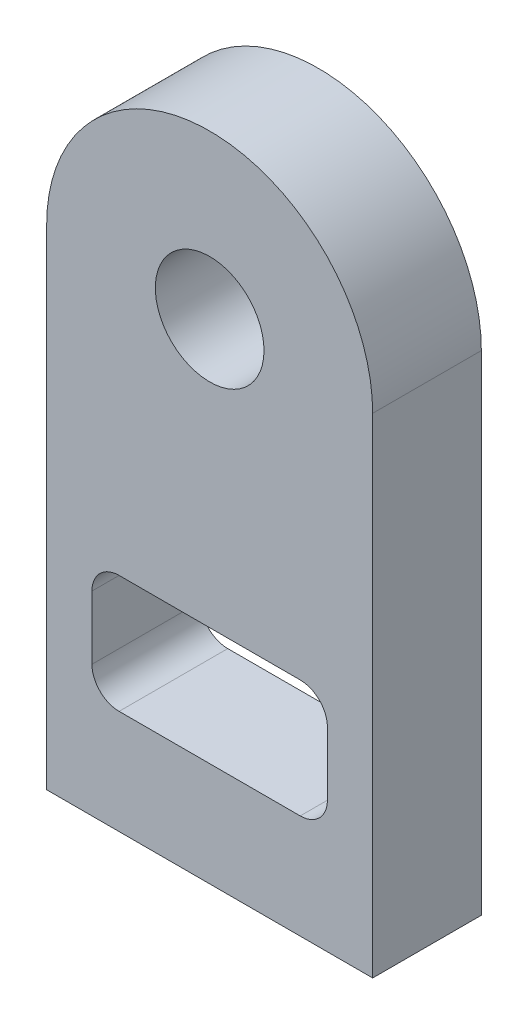
ISO-10303-21;
HEADER;
FILE_DESCRIPTION(('STEP AP214'),'2;1');
FILE_NAME('part.step','',(''),(''),'','','');
FILE_SCHEMA(('AUTOMOTIVE_DESIGN { 1 0 10303 214 1 1 1 1 }'));
ENDSEC;
DATA;
#1=APPLICATION_CONTEXT('core data for automotive mechanical design processes');
#2=APPLICATION_PROTOCOL_DEFINITION('international standard','automotive_design',2000,#1);
#3=PRODUCT_CONTEXT('',#1,'mechanical');
#4=PRODUCT('Part','Part','',(#3));
#5=PRODUCT_RELATED_PRODUCT_CATEGORY('part','',(#4));
#6=PRODUCT_DEFINITION_FORMATION('','',#4);
#7=PRODUCT_DEFINITION_CONTEXT('part definition',#1,'design');
#8=PRODUCT_DEFINITION('design','',#6,#7);
#9=PRODUCT_DEFINITION_SHAPE('','',#8);
#10=(LENGTH_UNIT() NAMED_UNIT(*) SI_UNIT(.MILLI.,.METRE.));
#11=(NAMED_UNIT(*) PLANE_ANGLE_UNIT() SI_UNIT($,.RADIAN.));
#12=(NAMED_UNIT(*) SI_UNIT($,.STERADIAN.) SOLID_ANGLE_UNIT());
#13=UNCERTAINTY_MEASURE_WITH_UNIT(LENGTH_MEASURE(1.E-05),#10,'distance_accuracy_value','');
#14=(GEOMETRIC_REPRESENTATION_CONTEXT(3) GLOBAL_UNCERTAINTY_ASSIGNED_CONTEXT((#13)) GLOBAL_UNIT_ASSIGNED_CONTEXT((#10,
#11,#12)) REPRESENTATION_CONTEXT('',''));
#15=CARTESIAN_POINT('',(0.,0.,0.));
#16=DIRECTION('',(0.,0.,1.));
#17=DIRECTION('',(1.,0.,0.));
#18=AXIS2_PLACEMENT_3D('',#15,#16,#17);
#19=CARTESIAN_POINT('',(155.0913565475,212.4940368431,3.));
#20=DIRECTION('',(0.,0.,1.));
#21=DIRECTION('',(1.,0.,0.));
#22=AXIS2_PLACEMENT_3D('',#19,#20,#21);
#23=PLANE('',#22);
#24=CARTESIAN_POINT('',(155.0913565475,212.4940368431,3.));
#25=DIRECTION('',(0.,0.,1.));
#26=DIRECTION('',(1.,0.,0.));
#27=AXIS2_PLACEMENT_3D('',#24,#25,#26);
#28=CIRCLE('',#27,1.5);
#29=CARTESIAN_POINT('',(156.5913565475,212.4940368431,3.));
#30=VERTEX_POINT('',#29);
#31=EDGE_CURVE('E187',#30,#30,#28,.T.);
#32=ORIENTED_EDGE('',*,*,#31,.F.);
#33=EDGE_LOOP('',(#32));
#34=FACE_BOUND('',#33,.T.);
#35=CARTESIAN_POINT('',(155.0913565475,212.4940368431,3.));
#36=DIRECTION('',(0.,0.,1.));
#37=DIRECTION('',(1.,0.,0.));
#38=AXIS2_PLACEMENT_3D('',#35,#36,#37);
#39=CIRCLE('',#38,4.5);
#40=CARTESIAN_POINT('',(159.5913565475,212.4940368431,3.));
#41=VERTEX_POINT('',#40);
#42=CARTESIAN_POINT('',(150.5913565475,212.4940368431,3.));
#43=VERTEX_POINT('',#42);
#44=EDGE_CURVE('E193',#41,#43,#39,.T.);
#45=ORIENTED_EDGE('',*,*,#44,.T.);
#46=DIRECTION('',(0.,-1.,0.));
#47=VECTOR('',#46,1.);
#48=CARTESIAN_POINT('',(150.5913565475,198.9940368431,3.));
#49=LINE('',#48,#47);
#50=CARTESIAN_POINT('',(150.5913565475,198.9940368431,3.));
#51=VERTEX_POINT('',#50);
#52=EDGE_CURVE('E196',#43,#51,#49,.T.);
#53=ORIENTED_EDGE('',*,*,#52,.T.);
#54=DIRECTION('',(1.,0.,0.));
#55=VECTOR('',#54,1.);
#56=CARTESIAN_POINT('',(159.5913565475,198.9940368431,3.));
#57=LINE('',#56,#55);
#58=CARTESIAN_POINT('',(159.5913565475,198.9940368431,3.));
#59=VERTEX_POINT('',#58);
#60=EDGE_CURVE('E199',#51,#59,#57,.T.);
#61=ORIENTED_EDGE('',*,*,#60,.T.);
#62=DIRECTION('',(0.,1.,0.));
#63=VECTOR('',#62,1.);
#64=CARTESIAN_POINT('',(159.5913565475,212.4940368431,3.));
#65=LINE('',#64,#63);
#66=EDGE_CURVE('E201',#59,#41,#65,.T.);
#67=ORIENTED_EDGE('',*,*,#66,.T.);
#68=EDGE_LOOP('',(#45,#53,#61,#67));
#69=FACE_BOUND('',#68,.T.);
#70=DIRECTION('',(1.,0.,0.));
#71=VECTOR('',#70,1.);
#72=CARTESIAN_POINT('',(157.5913565475,201.8690368431,3.));
#73=LINE('',#72,#71);
#74=CARTESIAN_POINT('',(152.5913565475,201.8690368431,3.));
#75=VERTEX_POINT('',#74);
#76=CARTESIAN_POINT('',(157.5913565475,201.8690368431,3.));
#77=VERTEX_POINT('',#76);
#78=EDGE_CURVE('E130',#75,#77,#73,.T.);
#79=ORIENTED_EDGE('',*,*,#78,.F.);
#80=CARTESIAN_POINT('',(152.5913565475,202.6190368431,3.));
#81=DIRECTION('',(0.,0.,1.));
#82=DIRECTION('',(1.,0.,0.));
#83=AXIS2_PLACEMENT_3D('',#80,#81,#82);
#84=CIRCLE('',#83,0.750000000000001);
#85=CARTESIAN_POINT('',(151.8413565475,202.6190368431,3.));
#86=VERTEX_POINT('',#85);
#87=EDGE_CURVE('E122',#86,#75,#84,.T.);
#88=ORIENTED_EDGE('',*,*,#87,.F.);
#89=DIRECTION('',(0.,-1.,0.));
#90=VECTOR('',#89,1.);
#91=CARTESIAN_POINT('',(151.8413565475,202.6190368431,3.));
#92=LINE('',#91,#90);
#93=CARTESIAN_POINT('',(151.8413565475,204.3690368431,3.));
#94=VERTEX_POINT('',#93);
#95=EDGE_CURVE('E155',#94,#86,#92,.T.);
#96=ORIENTED_EDGE('',*,*,#95,.F.);
#97=CARTESIAN_POINT('',(152.5913565475,204.3690368431,3.));
#98=DIRECTION('',(0.,0.,1.));
#99=DIRECTION('',(1.,0.,0.));
#100=AXIS2_PLACEMENT_3D('',#97,#98,#99);
#101=CIRCLE('',#100,0.750000000000001);
#102=CARTESIAN_POINT('',(152.5913565475,205.1190368431,3.));
#103=VERTEX_POINT('',#102);
#104=EDGE_CURVE('E153',#103,#94,#101,.T.);
#105=ORIENTED_EDGE('',*,*,#104,.F.);
#106=DIRECTION('',(-1.,0.,0.));
#107=VECTOR('',#106,1.);
#108=CARTESIAN_POINT('',(152.5913565475,205.1190368431,3.));
#109=LINE('',#108,#107);
#110=CARTESIAN_POINT('',(157.5913565475,205.1190368431,3.));
#111=VERTEX_POINT('',#110);
#112=EDGE_CURVE('E151',#111,#103,#109,.T.);
#113=ORIENTED_EDGE('',*,*,#112,.F.);
#114=CARTESIAN_POINT('',(157.5913565475,204.3690368431,3.));
#115=DIRECTION('',(0.,0.,1.));
#116=DIRECTION('',(1.,0.,0.));
#117=AXIS2_PLACEMENT_3D('',#114,#115,#116);
#118=CIRCLE('',#117,0.750000000000001);
#119=CARTESIAN_POINT('',(158.3413565475,204.3690368431,3.));
#120=VERTEX_POINT('',#119);
#121=EDGE_CURVE('E149',#120,#111,#118,.T.);
#122=ORIENTED_EDGE('',*,*,#121,.F.);
#123=DIRECTION('',(0.,1.,0.));
#124=VECTOR('',#123,1.);
#125=CARTESIAN_POINT('',(158.3413565475,204.3690368431,3.));
#126=LINE('',#125,#124);
#127=CARTESIAN_POINT('',(158.3413565475,202.6190368431,3.));
#128=VERTEX_POINT('',#127);
#129=EDGE_CURVE('E145',#128,#120,#126,.T.);
#130=ORIENTED_EDGE('',*,*,#129,.F.);
#131=CARTESIAN_POINT('',(157.5913565475,202.6190368431,3.));
#132=DIRECTION('',(0.,0.,1.));
#133=DIRECTION('',(1.,0.,0.));
#134=AXIS2_PLACEMENT_3D('',#131,#132,#133);
#135=CIRCLE('',#134,0.750000000000001);
#136=EDGE_CURVE('E143',#77,#128,#135,.T.);
#137=ORIENTED_EDGE('',*,*,#136,.F.);
#138=EDGE_LOOP('',(#79,#88,#96,#105,#113,#122,#130,#137));
#139=FACE_BOUND('',#138,.T.);
#140=ADVANCED_FACE('F33',(#34,#69,#139),#23,.T.);
#141=CARTESIAN_POINT('',(155.0913565475,212.4940368431,0.));
#142=DIRECTION('',(0.,0.,1.));
#143=DIRECTION('',(1.,0.,0.));
#144=AXIS2_PLACEMENT_3D('',#141,#142,#143);
#145=PLANE('',#144);
#146=CARTESIAN_POINT('',(155.0913565475,212.4940368431,0.));
#147=DIRECTION('',(0.,0.,1.));
#148=DIRECTION('',(1.,0.,0.));
#149=AXIS2_PLACEMENT_3D('',#146,#147,#148);
#150=CIRCLE('',#149,1.5);
#151=CARTESIAN_POINT('',(156.5913565475,212.4940368431,0.));
#152=VERTEX_POINT('',#151);
#153=EDGE_CURVE('E138',#152,#152,#150,.T.);
#154=ORIENTED_EDGE('',*,*,#153,.T.);
#155=EDGE_LOOP('',(#154));
#156=FACE_BOUND('',#155,.T.);
#157=CARTESIAN_POINT('',(155.0913565475,212.4940368431,0.));
#158=DIRECTION('',(0.,0.,1.));
#159=DIRECTION('',(1.,0.,0.));
#160=AXIS2_PLACEMENT_3D('',#157,#158,#159);
#161=CIRCLE('',#160,4.5);
#162=CARTESIAN_POINT('',(159.5913565475,212.4940368431,0.));
#163=VERTEX_POINT('',#162);
#164=CARTESIAN_POINT('',(150.5913565475,212.4940368431,0.));
#165=VERTEX_POINT('',#164);
#166=EDGE_CURVE('E190',#163,#165,#161,.T.);
#167=ORIENTED_EDGE('',*,*,#166,.F.);
#168=DIRECTION('',(0.,1.,0.));
#169=VECTOR('',#168,1.);
#170=CARTESIAN_POINT('',(159.5913565475,212.4940368431,0.));
#171=LINE('',#170,#169);
#172=CARTESIAN_POINT('',(159.5913565475,198.9940368431,0.));
#173=VERTEX_POINT('',#172);
#174=EDGE_CURVE('E197',#173,#163,#171,.T.);
#175=ORIENTED_EDGE('',*,*,#174,.F.);
#176=DIRECTION('',(1.,0.,0.));
#177=VECTOR('',#176,1.);
#178=CARTESIAN_POINT('',(159.5913565475,198.9940368431,0.));
#179=LINE('',#178,#177);
#180=CARTESIAN_POINT('',(150.5913565475,198.9940368431,0.));
#181=VERTEX_POINT('',#180);
#182=EDGE_CURVE('E208',#181,#173,#179,.T.);
#183=ORIENTED_EDGE('',*,*,#182,.F.);
#184=DIRECTION('',(0.,-1.,0.));
#185=VECTOR('',#184,1.);
#186=CARTESIAN_POINT('',(150.5913565475,198.9940368431,0.));
#187=LINE('',#186,#185);
#188=EDGE_CURVE('E206',#165,#181,#187,.T.);
#189=ORIENTED_EDGE('',*,*,#188,.F.);
#190=EDGE_LOOP('',(#167,#175,#183,#189));
#191=FACE_BOUND('',#190,.T.);
#192=CARTESIAN_POINT('',(152.5913565475,202.6190368431,0.));
#193=DIRECTION('',(0.,0.,1.));
#194=DIRECTION('',(1.,0.,0.));
#195=AXIS2_PLACEMENT_3D('',#192,#193,#194);
#196=CIRCLE('',#195,0.750000000000001);
#197=CARTESIAN_POINT('',(151.8413565475,202.6190368431,0.));
#198=VERTEX_POINT('',#197);
#199=CARTESIAN_POINT('',(152.5913565475,201.8690368431,0.));
#200=VERTEX_POINT('',#199);
#201=EDGE_CURVE('E56',#198,#200,#196,.T.);
#202=ORIENTED_EDGE('',*,*,#201,.T.);
#203=DIRECTION('',(1.,0.,0.));
#204=VECTOR('',#203,1.);
#205=CARTESIAN_POINT('',(157.5913565475,201.8690368431,0.));
#206=LINE('',#205,#204);
#207=CARTESIAN_POINT('',(157.5913565475,201.8690368431,0.));
#208=VERTEX_POINT('',#207);
#209=EDGE_CURVE('E137',#200,#208,#206,.T.);
#210=ORIENTED_EDGE('',*,*,#209,.T.);
#211=CARTESIAN_POINT('',(157.5913565475,202.6190368431,0.));
#212=DIRECTION('',(0.,0.,1.));
#213=DIRECTION('',(1.,0.,0.));
#214=AXIS2_PLACEMENT_3D('',#211,#212,#213);
#215=CIRCLE('',#214,0.750000000000001);
#216=CARTESIAN_POINT('',(158.3413565475,202.6190368431,0.));
#217=VERTEX_POINT('',#216);
#218=EDGE_CURVE('E159',#208,#217,#215,.T.);
#219=ORIENTED_EDGE('',*,*,#218,.T.);
#220=DIRECTION('',(0.,1.,0.));
#221=VECTOR('',#220,1.);
#222=CARTESIAN_POINT('',(158.3413565475,204.3690368431,0.));
#223=LINE('',#222,#221);
#224=CARTESIAN_POINT('',(158.3413565475,204.3690368431,0.));
#225=VERTEX_POINT('',#224);
#226=EDGE_CURVE('E162',#217,#225,#223,.T.);
#227=ORIENTED_EDGE('',*,*,#226,.T.);
#228=CARTESIAN_POINT('',(157.5913565475,204.3690368431,0.));
#229=DIRECTION('',(0.,0.,1.));
#230=DIRECTION('',(1.,0.,0.));
#231=AXIS2_PLACEMENT_3D('',#228,#229,#230);
#232=CIRCLE('',#231,0.750000000000001);
#233=CARTESIAN_POINT('',(157.5913565475,205.1190368431,0.));
#234=VERTEX_POINT('',#233);
#235=EDGE_CURVE('E165',#225,#234,#232,.T.);
#236=ORIENTED_EDGE('',*,*,#235,.T.);
#237=DIRECTION('',(-1.,0.,0.));
#238=VECTOR('',#237,1.);
#239=CARTESIAN_POINT('',(152.5913565475,205.1190368431,0.));
#240=LINE('',#239,#238);
#241=CARTESIAN_POINT('',(152.5913565475,205.1190368431,0.));
#242=VERTEX_POINT('',#241);
#243=EDGE_CURVE('E168',#234,#242,#240,.T.);
#244=ORIENTED_EDGE('',*,*,#243,.T.);
#245=CARTESIAN_POINT('',(152.5913565475,204.3690368431,0.));
#246=DIRECTION('',(0.,0.,1.));
#247=DIRECTION('',(1.,0.,0.));
#248=AXIS2_PLACEMENT_3D('',#245,#246,#247);
#249=CIRCLE('',#248,0.750000000000001);
#250=CARTESIAN_POINT('',(151.8413565475,204.3690368431,0.));
#251=VERTEX_POINT('',#250);
#252=EDGE_CURVE('E171',#242,#251,#249,.T.);
#253=ORIENTED_EDGE('',*,*,#252,.T.);
#254=DIRECTION('',(0.,-1.,0.));
#255=VECTOR('',#254,1.);
#256=CARTESIAN_POINT('',(151.8413565475,202.6190368431,0.));
#257=LINE('',#256,#255);
#258=EDGE_CURVE('E131',#251,#198,#257,.T.);
#259=ORIENTED_EDGE('',*,*,#258,.T.);
#260=EDGE_LOOP('',(#202,#210,#219,#227,#236,#244,#253,#259));
#261=FACE_BOUND('',#260,.T.);
#262=ADVANCED_FACE('F226',(#156,#191,#261),#145,.F.);
#263=CARTESIAN_POINT('',(155.0913565475,212.4940368431,3.));
#264=DIRECTION('',(0.,0.,-1.));
#265=DIRECTION('',(-1.,0.,0.));
#266=AXIS2_PLACEMENT_3D('',#263,#264,#265);
#267=CYLINDRICAL_SURFACE('',#266,4.5);
#268=ORIENTED_EDGE('',*,*,#166,.T.);
#269=DIRECTION('',(0.,0.,-1.));
#270=VECTOR('',#269,1.);
#271=CARTESIAN_POINT('',(150.5913565475,212.4940368431,3.));
#272=LINE('',#271,#270);
#273=EDGE_CURVE('E11',#43,#165,#272,.T.);
#274=ORIENTED_EDGE('',*,*,#273,.F.);
#275=ORIENTED_EDGE('',*,*,#44,.F.);
#276=DIRECTION('',(0.,0.,-1.));
#277=VECTOR('',#276,1.);
#278=CARTESIAN_POINT('',(159.5913565475,212.4940368431,3.));
#279=LINE('',#278,#277);
#280=EDGE_CURVE('E203',#41,#163,#279,.T.);
#281=ORIENTED_EDGE('',*,*,#280,.T.);
#282=EDGE_LOOP('',(#268,#274,#275,#281));
#283=FACE_BOUND('',#282,.T.);
#284=ADVANCED_FACE('F35',(#283),#267,.T.);
#285=CARTESIAN_POINT('',(150.5913565475,198.9940368431,3.));
#286=DIRECTION('',(1.,0.,0.));
#287=DIRECTION('',(0.,0.,-1.));
#288=AXIS2_PLACEMENT_3D('',#285,#286,#287);
#289=PLANE('',#288);
#290=ORIENTED_EDGE('',*,*,#188,.T.);
#291=DIRECTION('',(0.,0.,-1.));
#292=VECTOR('',#291,1.);
#293=CARTESIAN_POINT('',(150.5913565475,198.9940368431,3.));
#294=LINE('',#293,#292);
#295=EDGE_CURVE('E41',#51,#181,#294,.T.);
#296=ORIENTED_EDGE('',*,*,#295,.F.);
#297=ORIENTED_EDGE('',*,*,#52,.F.);
#298=ORIENTED_EDGE('',*,*,#273,.T.);
#299=EDGE_LOOP('',(#290,#296,#297,#298));
#300=FACE_BOUND('',#299,.T.);
#301=ADVANCED_FACE('F236',(#300),#289,.F.);
#302=CARTESIAN_POINT('',(159.5913565475,198.9940368431,3.));
#303=DIRECTION('',(0.,1.,0.));
#304=DIRECTION('',(0.,0.,1.));
#305=AXIS2_PLACEMENT_3D('',#302,#303,#304);
#306=PLANE('',#305);
#307=ORIENTED_EDGE('',*,*,#182,.T.);
#308=DIRECTION('',(0.,0.,-1.));
#309=VECTOR('',#308,1.);
#310=CARTESIAN_POINT('',(159.5913565475,198.9940368431,3.));
#311=LINE('',#310,#309);
#312=EDGE_CURVE('E213',#59,#173,#311,.T.);
#313=ORIENTED_EDGE('',*,*,#312,.F.);
#314=ORIENTED_EDGE('',*,*,#60,.F.);
#315=ORIENTED_EDGE('',*,*,#295,.T.);
#316=EDGE_LOOP('',(#307,#313,#314,#315));
#317=FACE_BOUND('',#316,.T.);
#318=ADVANCED_FACE('F220',(#317),#306,.F.);
#319=CARTESIAN_POINT('',(159.5913565475,212.4940368431,3.));
#320=DIRECTION('',(-1.,0.,0.));
#321=DIRECTION('',(0.,0.,1.));
#322=AXIS2_PLACEMENT_3D('',#319,#320,#321);
#323=PLANE('',#322);
#324=ORIENTED_EDGE('',*,*,#174,.T.);
#325=ORIENTED_EDGE('',*,*,#280,.F.);
#326=ORIENTED_EDGE('',*,*,#66,.F.);
#327=ORIENTED_EDGE('',*,*,#312,.T.);
#328=EDGE_LOOP('',(#324,#325,#326,#327));
#329=FACE_BOUND('',#328,.T.);
#330=ADVANCED_FACE('F230',(#329),#323,.F.);
#331=CARTESIAN_POINT('',(155.0913565475,212.4940368431,3.));
#332=DIRECTION('',(0.,0.,-1.));
#333=DIRECTION('',(-1.,0.,0.));
#334=AXIS2_PLACEMENT_3D('',#331,#332,#333);
#335=CYLINDRICAL_SURFACE('',#334,1.5);
#336=ORIENTED_EDGE('',*,*,#31,.T.);
#337=EDGE_LOOP('',(#336));
#338=FACE_BOUND('',#337,.T.);
#339=ORIENTED_EDGE('',*,*,#153,.F.);
#340=EDGE_LOOP('',(#339));
#341=FACE_BOUND('',#340,.T.);
#342=ADVANCED_FACE('F253',(#338,#341),#335,.F.);
#343=CARTESIAN_POINT('',(152.5913565475,202.6190368431,3.));
#344=DIRECTION('',(0.,0.,-1.));
#345=DIRECTION('',(-1.,0.,0.));
#346=AXIS2_PLACEMENT_3D('',#343,#344,#345);
#347=CYLINDRICAL_SURFACE('',#346,0.750000000000001);
#348=ORIENTED_EDGE('',*,*,#201,.F.);
#349=DIRECTION('',(0.,0.,-1.));
#350=VECTOR('',#349,1.);
#351=CARTESIAN_POINT('',(151.8413565475,202.6190368431,3.));
#352=LINE('',#351,#350);
#353=EDGE_CURVE('E126',#86,#198,#352,.T.);
#354=ORIENTED_EDGE('',*,*,#353,.F.);
#355=ORIENTED_EDGE('',*,*,#87,.T.);
#356=DIRECTION('',(0.,0.,-1.));
#357=VECTOR('',#356,1.);
#358=CARTESIAN_POINT('',(152.5913565475,201.8690368431,3.));
#359=LINE('',#358,#357);
#360=EDGE_CURVE('E125',#75,#200,#359,.T.);
#361=ORIENTED_EDGE('',*,*,#360,.T.);
#362=EDGE_LOOP('',(#348,#354,#355,#361));
#363=FACE_BOUND('',#362,.T.);
#364=ADVANCED_FACE('F124',(#363),#347,.F.);
#365=CARTESIAN_POINT('',(157.5913565475,201.8690368431,3.));
#366=DIRECTION('',(0.,1.,0.));
#367=DIRECTION('',(0.,0.,1.));
#368=AXIS2_PLACEMENT_3D('',#365,#366,#367);
#369=PLANE('',#368);
#370=ORIENTED_EDGE('',*,*,#209,.F.);
#371=ORIENTED_EDGE('',*,*,#360,.F.);
#372=ORIENTED_EDGE('',*,*,#78,.T.);
#373=DIRECTION('',(0.,0.,-1.));
#374=VECTOR('',#373,1.);
#375=CARTESIAN_POINT('',(157.5913565475,201.8690368431,3.));
#376=LINE('',#375,#374);
#377=EDGE_CURVE('E139',#77,#208,#376,.T.);
#378=ORIENTED_EDGE('',*,*,#377,.T.);
#379=EDGE_LOOP('',(#370,#371,#372,#378));
#380=FACE_BOUND('',#379,.T.);
#381=ADVANCED_FACE('F134',(#380),#369,.T.);
#382=CARTESIAN_POINT('',(157.5913565475,202.6190368431,3.));
#383=DIRECTION('',(0.,0.,-1.));
#384=DIRECTION('',(-1.,0.,0.));
#385=AXIS2_PLACEMENT_3D('',#382,#383,#384);
#386=CYLINDRICAL_SURFACE('',#385,0.750000000000001);
#387=ORIENTED_EDGE('',*,*,#218,.F.);
#388=ORIENTED_EDGE('',*,*,#377,.F.);
#389=ORIENTED_EDGE('',*,*,#136,.T.);
#390=DIRECTION('',(0.,0.,-1.));
#391=VECTOR('',#390,1.);
#392=CARTESIAN_POINT('',(158.3413565475,202.6190368431,3.));
#393=LINE('',#392,#391);
#394=EDGE_CURVE('E184',#128,#217,#393,.T.);
#395=ORIENTED_EDGE('',*,*,#394,.T.);
#396=EDGE_LOOP('',(#387,#388,#389,#395));
#397=FACE_BOUND('',#396,.T.);
#398=ADVANCED_FACE('F269',(#397),#386,.F.);
#399=CARTESIAN_POINT('',(158.3413565475,204.3690368431,3.));
#400=DIRECTION('',(-1.,0.,0.));
#401=DIRECTION('',(0.,0.,1.));
#402=AXIS2_PLACEMENT_3D('',#399,#400,#401);
#403=PLANE('',#402);
#404=ORIENTED_EDGE('',*,*,#226,.F.);
#405=ORIENTED_EDGE('',*,*,#394,.F.);
#406=ORIENTED_EDGE('',*,*,#129,.T.);
#407=DIRECTION('',(0.,0.,-1.));
#408=VECTOR('',#407,1.);
#409=CARTESIAN_POINT('',(158.3413565475,204.3690368431,3.));
#410=LINE('',#409,#408);
#411=EDGE_CURVE('E182',#120,#225,#410,.T.);
#412=ORIENTED_EDGE('',*,*,#411,.T.);
#413=EDGE_LOOP('',(#404,#405,#406,#412));
#414=FACE_BOUND('',#413,.T.);
#415=ADVANCED_FACE('F274',(#414),#403,.T.);
#416=CARTESIAN_POINT('',(157.5913565475,204.3690368431,3.));
#417=DIRECTION('',(0.,0.,-1.));
#418=DIRECTION('',(-1.,0.,0.));
#419=AXIS2_PLACEMENT_3D('',#416,#417,#418);
#420=CYLINDRICAL_SURFACE('',#419,0.750000000000001);
#421=ORIENTED_EDGE('',*,*,#235,.F.);
#422=ORIENTED_EDGE('',*,*,#411,.F.);
#423=ORIENTED_EDGE('',*,*,#121,.T.);
#424=DIRECTION('',(0.,0.,-1.));
#425=VECTOR('',#424,1.);
#426=CARTESIAN_POINT('',(157.5913565475,205.1190368431,3.));
#427=LINE('',#426,#425);
#428=EDGE_CURVE('E180',#111,#234,#427,.T.);
#429=ORIENTED_EDGE('',*,*,#428,.T.);
#430=EDGE_LOOP('',(#421,#422,#423,#429));
#431=FACE_BOUND('',#430,.T.);
#432=ADVANCED_FACE('F278',(#431),#420,.F.);
#433=CARTESIAN_POINT('',(152.5913565475,205.1190368431,3.));
#434=DIRECTION('',(0.,-1.,0.));
#435=DIRECTION('',(0.,0.,-1.));
#436=AXIS2_PLACEMENT_3D('',#433,#434,#435);
#437=PLANE('',#436);
#438=ORIENTED_EDGE('',*,*,#243,.F.);
#439=ORIENTED_EDGE('',*,*,#428,.F.);
#440=ORIENTED_EDGE('',*,*,#112,.T.);
#441=DIRECTION('',(0.,0.,-1.));
#442=VECTOR('',#441,1.);
#443=CARTESIAN_POINT('',(152.5913565475,205.1190368431,3.));
#444=LINE('',#443,#442);
#445=EDGE_CURVE('E178',#103,#242,#444,.T.);
#446=ORIENTED_EDGE('',*,*,#445,.T.);
#447=EDGE_LOOP('',(#438,#439,#440,#446));
#448=FACE_BOUND('',#447,.T.);
#449=ADVANCED_FACE('F282',(#448),#437,.T.);
#450=CARTESIAN_POINT('',(152.5913565475,204.3690368431,3.));
#451=DIRECTION('',(0.,0.,-1.));
#452=DIRECTION('',(-1.,0.,0.));
#453=AXIS2_PLACEMENT_3D('',#450,#451,#452);
#454=CYLINDRICAL_SURFACE('',#453,0.750000000000001);
#455=ORIENTED_EDGE('',*,*,#252,.F.);
#456=ORIENTED_EDGE('',*,*,#445,.F.);
#457=ORIENTED_EDGE('',*,*,#104,.T.);
#458=DIRECTION('',(0.,0.,-1.));
#459=VECTOR('',#458,1.);
#460=CARTESIAN_POINT('',(151.8413565475,204.3690368431,3.));
#461=LINE('',#460,#459);
#462=EDGE_CURVE('E48',#94,#251,#461,.T.);
#463=ORIENTED_EDGE('',*,*,#462,.T.);
#464=EDGE_LOOP('',(#455,#456,#457,#463));
#465=FACE_BOUND('',#464,.T.);
#466=ADVANCED_FACE('F286',(#465),#454,.F.);
#467=CARTESIAN_POINT('',(151.8413565475,202.6190368431,3.));
#468=DIRECTION('',(1.,0.,0.));
#469=DIRECTION('',(0.,0.,-1.));
#470=AXIS2_PLACEMENT_3D('',#467,#468,#469);
#471=PLANE('',#470);
#472=ORIENTED_EDGE('',*,*,#258,.F.);
#473=ORIENTED_EDGE('',*,*,#462,.F.);
#474=ORIENTED_EDGE('',*,*,#95,.T.);
#475=ORIENTED_EDGE('',*,*,#353,.T.);
#476=EDGE_LOOP('',(#472,#473,#474,#475));
#477=FACE_BOUND('',#476,.T.);
#478=ADVANCED_FACE('F290',(#477),#471,.T.);
#479=CLOSED_SHELL('',(#140,#262,#284,#301,#318,#330,#342,#364,#381,#398,#415,#432,#449,#466,#478));
#480=MANIFOLD_SOLID_BREP('B2',#479);
#481=ADVANCED_BREP_SHAPE_REPRESENTATION('',(#18,#480),#14);
#482=SHAPE_DEFINITION_REPRESENTATION(#9,#481);
ENDSEC;
END-ISO-10303-21;
